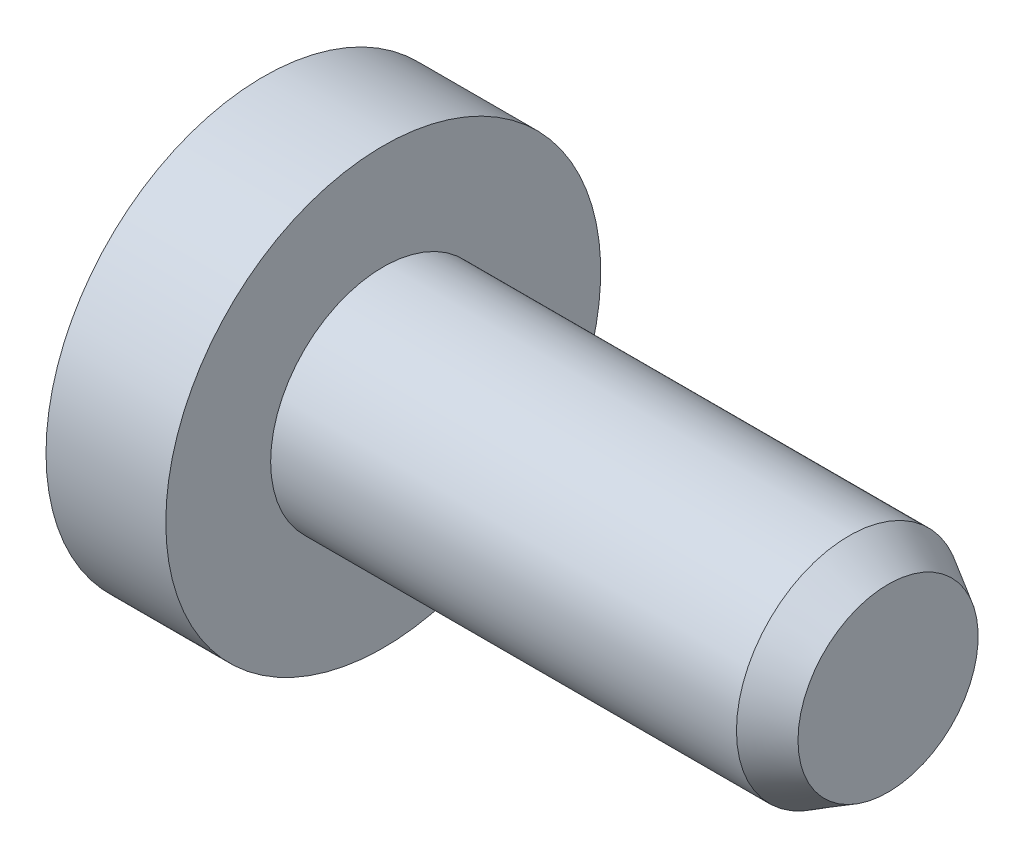
ISO-10303-21;
HEADER;
FILE_DESCRIPTION(('STEP AP214'),'2;1');
FILE_NAME('part.step','',(''),(''),'','','');
FILE_SCHEMA(('AUTOMOTIVE_DESIGN { 1 0 10303 214 1 1 1 1 }'));
ENDSEC;
DATA;
#1=APPLICATION_CONTEXT('core data for automotive mechanical design processes');
#2=APPLICATION_PROTOCOL_DEFINITION('international standard','automotive_design',2000,#1);
#3=PRODUCT_CONTEXT('',#1,'mechanical');
#4=PRODUCT('Part','Part','',(#3));
#5=PRODUCT_RELATED_PRODUCT_CATEGORY('part','',(#4));
#6=PRODUCT_DEFINITION_FORMATION('','',#4);
#7=PRODUCT_DEFINITION_CONTEXT('part definition',#1,'design');
#8=PRODUCT_DEFINITION('design','',#6,#7);
#9=PRODUCT_DEFINITION_SHAPE('','',#8);
#10=(LENGTH_UNIT() NAMED_UNIT(*) SI_UNIT(.MILLI.,.METRE.));
#11=(NAMED_UNIT(*) PLANE_ANGLE_UNIT() SI_UNIT($,.RADIAN.));
#12=(NAMED_UNIT(*) SI_UNIT($,.STERADIAN.) SOLID_ANGLE_UNIT());
#13=UNCERTAINTY_MEASURE_WITH_UNIT(LENGTH_MEASURE(1.E-05),#10,'distance_accuracy_value','');
#14=(GEOMETRIC_REPRESENTATION_CONTEXT(3) GLOBAL_UNCERTAINTY_ASSIGNED_CONTEXT((#13)) GLOBAL_UNIT_ASSIGNED_CONTEXT((#10,
#11,#12)) REPRESENTATION_CONTEXT('',''));
#15=CARTESIAN_POINT('',(0.,0.,0.));
#16=DIRECTION('',(0.,0.,1.));
#17=DIRECTION('',(1.,0.,0.));
#18=AXIS2_PLACEMENT_3D('',#15,#16,#17);
#19=CARTESIAN_POINT('',(2.6,0.,0.));
#20=DIRECTION('',(-1.,0.,0.));
#21=DIRECTION('',(0.,1.,0.));
#22=AXIS2_PLACEMENT_3D('',#19,#20,#21);
#23=SPHERICAL_SURFACE('',#22,5.);
#24=CARTESIAN_POINT('',(-1.5424630354416,0.,0.));
#25=DIRECTION('',(-1.,0.,0.));
#26=DIRECTION('',(0.,0.,1.));
#27=AXIS2_PLACEMENT_3D('',#24,#25,#26);
#28=CIRCLE('',#27,2.8);
#29=CARTESIAN_POINT('',(-1.5424630354416,0.,2.8));
#30=VERTEX_POINT('',#29);
#31=EDGE_CURVE('E190',#30,#30,#28,.T.);
#32=ORIENTED_EDGE('',*,*,#31,.T.);
#33=EDGE_LOOP('',(#32));
#34=FACE_BOUND('',#33,.T.);
#35=CARTESIAN_POINT('',(2.54536900183452,0.126064979712084,0.504259918848463));
#36=DIRECTION('',(0.104528463267654,-0.241206989505462,-0.964827958021852));
#37=DIRECTION('',(0.,0.970142500145332,-0.242535625036333));
#38=AXIS2_PLACEMENT_3D('',#35,#36,#37);
#39=CIRCLE('',#38,4.97260947684137);
#40=CARTESIAN_POINT('',(-2.16503660423949,1.47530435197317,-0.343370396666362));
#41=VERTEX_POINT('',#40);
#42=CARTESIAN_POINT('',(-2.31386531181066,0.898643984119679,-0.21532925298122));
#43=VERTEX_POINT('',#42);
#44=EDGE_CURVE('E11',#41,#43,#39,.F.);
#45=ORIENTED_EDGE('',*,*,#44,.F.);
#46=CARTESIAN_POINT('',(2.70130276994784,0.963831473505927,0.));
#47=DIRECTION('',(0.104528463267654,0.994521895368274,0.));
#48=DIRECTION('',(-0.994521895368275,0.104528463267653,0.));
#49=AXIS2_PLACEMENT_3D('',#46,#47,#48);
#50=CIRCLE('',#49,4.90517753394108);
#51=CARTESIAN_POINT('',(-2.16503660423949,1.47530435197316,0.343370396666362));
#52=VERTEX_POINT('',#51);
#53=EDGE_CURVE('E42',#52,#41,#50,.F.);
#54=ORIENTED_EDGE('',*,*,#53,.F.);
#55=CARTESIAN_POINT('',(2.54536900183452,0.126064979712112,-0.504259918848463));
#56=DIRECTION('',(0.104528463267654,-0.241206989505463,0.964827958021851));
#57=DIRECTION('',(0.,-0.970142500145332,-0.242535625036333));
#58=AXIS2_PLACEMENT_3D('',#55,#56,#57);
#59=CIRCLE('',#58,4.97260947684137);
#60=CARTESIAN_POINT('',(-2.31386531181066,0.898643984119693,0.21532925298122));
#61=VERTEX_POINT('',#60);
#62=EDGE_CURVE('E326',#61,#52,#59,.F.);
#63=ORIENTED_EDGE('',*,*,#62,.F.);
#64=CARTESIAN_POINT('',(2.61240552294261,0.0590153332605675,0.10221755563293));
#65=DIRECTION('',(0.104528463267654,0.49726094768413,0.861281226008778));
#66=DIRECTION('',(0.,-0.866025403784443,0.499999999999993));
#67=AXIS2_PLACEMENT_3D('',#64,#65,#66);
#68=CIRCLE('',#67,4.99859128802917);
#69=CARTESIAN_POINT('',(-2.35587459368451,0.468672066413427,0.468672066413406));
#70=VERTEX_POINT('',#69);
#71=EDGE_CURVE('E324',#70,#61,#68,.F.);
#72=ORIENTED_EDGE('',*,*,#71,.F.);
#73=CARTESIAN_POINT('',(2.61240552294261,0.102217555632889,0.0590153332605259));
#74=DIRECTION('',(0.104528463267654,0.861281226008778,0.497260947684129));
#75=DIRECTION('',(0.,-0.499999999999993,0.866025403784443));
#76=AXIS2_PLACEMENT_3D('',#73,#74,#75);
#77=CIRCLE('',#76,4.99859128802917);
#78=CARTESIAN_POINT('',(-2.31386531181066,0.215329252981206,0.898643984119665));
#79=VERTEX_POINT('',#78);
#80=EDGE_CURVE('E322',#79,#70,#77,.F.);
#81=ORIENTED_EDGE('',*,*,#80,.F.);
#82=CARTESIAN_POINT('',(2.54536900183452,-0.504259918848497,0.126064979712071));
#83=DIRECTION('',(0.104528463267654,0.964827958021851,-0.241206989505462));
#84=DIRECTION('',(0.,0.242535625036333,0.970142500145332));
#85=AXIS2_PLACEMENT_3D('',#82,#83,#84);
#86=CIRCLE('',#85,4.97260947684137);
#87=CARTESIAN_POINT('',(-2.16503660423949,0.34337039666632,1.47530435197316));
#88=VERTEX_POINT('',#87);
#89=EDGE_CURVE('E320',#88,#79,#86,.F.);
#90=ORIENTED_EDGE('',*,*,#89,.F.);
#91=CARTESIAN_POINT('',(2.70130276994784,0.,0.963831473505941));
#92=DIRECTION('',(0.104528463267654,0.,0.994521895368274));
#93=DIRECTION('',(0.994521895368275,0.,-0.104528463267654));
#94=AXIS2_PLACEMENT_3D('',#91,#92,#93);
#95=CIRCLE('',#94,4.90517753394107);
#96=CARTESIAN_POINT('',(-2.16503660423949,-0.343370396666376,1.47530435197317));
#97=VERTEX_POINT('',#96);
#98=EDGE_CURVE('E318',#97,#88,#95,.F.);
#99=ORIENTED_EDGE('',*,*,#98,.F.);
#100=CARTESIAN_POINT('',(2.54536900183452,0.504259918848456,0.126064979712112));
#101=DIRECTION('',(0.104528463267654,-0.964827958021851,-0.241206989505463));
#102=DIRECTION('',(0.,0.242535625036333,-0.970142500145332));
#103=AXIS2_PLACEMENT_3D('',#100,#101,#102);
#104=CIRCLE('',#103,4.97260947684137);
#105=CARTESIAN_POINT('',(-2.31386531181066,-0.21532925298122,0.898643984119707));
#106=VERTEX_POINT('',#105);
#107=EDGE_CURVE('E316',#106,#97,#104,.F.);
#108=ORIENTED_EDGE('',*,*,#107,.F.);
#109=CARTESIAN_POINT('',(2.61240552294261,-0.102217555632972,0.0590153332605675));
#110=DIRECTION('',(0.104528463267654,-0.861281226008778,0.49726094768413));
#111=DIRECTION('',(0.,-0.499999999999992,-0.866025403784443));
#112=AXIS2_PLACEMENT_3D('',#109,#110,#111);
#113=CIRCLE('',#112,4.99859128802917);
#114=CARTESIAN_POINT('',(-2.35587459368451,-0.468672066413454,0.468672066413447));
#115=VERTEX_POINT('',#114);
#116=EDGE_CURVE('E314',#115,#106,#113,.F.);
#117=ORIENTED_EDGE('',*,*,#116,.F.);
#118=CARTESIAN_POINT('',(2.61240552294261,-0.0590153332606091,0.10221755563293));
#119=DIRECTION('',(0.104528463267654,-0.497260947684129,0.861281226008779));
#120=DIRECTION('',(0.,-0.866025403784443,-0.499999999999992));
#121=AXIS2_PLACEMENT_3D('',#118,#119,#120);
#122=CIRCLE('',#121,4.99859128802917);
#123=CARTESIAN_POINT('',(-2.31386531181066,-0.898643984119749,0.21532925298122));
#124=VERTEX_POINT('',#123);
#125=EDGE_CURVE('E312',#124,#115,#122,.F.);
#126=ORIENTED_EDGE('',*,*,#125,.F.);
#127=CARTESIAN_POINT('',(2.54536900183452,-0.126064979712154,-0.504259918848504));
#128=DIRECTION('',(0.104528463267654,0.241206989505462,0.964827958021851));
#129=DIRECTION('',(0.,-0.970142500145332,0.242535625036333));
#130=AXIS2_PLACEMENT_3D('',#127,#128,#129);
#131=CIRCLE('',#130,4.97260947684137);
#132=CARTESIAN_POINT('',(-2.16503660423949,-1.47530435197318,0.343370396666293));
#133=VERTEX_POINT('',#132);
#134=EDGE_CURVE('E310',#133,#124,#131,.F.);
#135=ORIENTED_EDGE('',*,*,#134,.F.);
#136=CARTESIAN_POINT('',(2.70130276994784,-0.963831473505969,0.));
#137=DIRECTION('',(0.104528463267654,-0.994521895368273,0.));
#138=DIRECTION('',(0.994521895368275,0.104528463267654,0.));
#139=AXIS2_PLACEMENT_3D('',#136,#137,#138);
#140=CIRCLE('',#139,4.90517753394107);
#141=CARTESIAN_POINT('',(-2.16503660423949,-1.47530435197318,-0.343370396666362));
#142=VERTEX_POINT('',#141);
#143=EDGE_CURVE('E308',#142,#133,#140,.F.);
#144=ORIENTED_EDGE('',*,*,#143,.F.);
#145=CARTESIAN_POINT('',(2.54536900183452,-0.126064979712154,0.504259918848463));
#146=DIRECTION('',(0.104528463267654,0.241206989505463,-0.964827958021851));
#147=DIRECTION('',(0.,0.970142500145332,0.242535625036333));
#148=AXIS2_PLACEMENT_3D('',#145,#146,#147);
#149=CIRCLE('',#148,4.97260947684137);
#150=CARTESIAN_POINT('',(-2.31386531181066,-0.898643984119721,-0.215329252981275));
#151=VERTEX_POINT('',#150);
#152=EDGE_CURVE('E306',#151,#142,#149,.F.);
#153=ORIENTED_EDGE('',*,*,#152,.F.);
#154=CARTESIAN_POINT('',(2.61240552294261,-0.0590153332606022,-0.102217555632972));
#155=DIRECTION('',(0.104528463267654,-0.49726094768413,-0.861281226008778));
#156=DIRECTION('',(0.,0.866025403784443,-0.499999999999993));
#157=AXIS2_PLACEMENT_3D('',#154,#155,#156);
#158=CIRCLE('',#157,4.99859128802917);
#159=CARTESIAN_POINT('',(-2.35587459368451,-0.468672066413475,-0.468672066413434));
#160=VERTEX_POINT('',#159);
#161=EDGE_CURVE('E304',#160,#151,#158,.F.);
#162=ORIENTED_EDGE('',*,*,#161,.F.);
#163=CARTESIAN_POINT('',(2.61240552294261,-0.102217555632958,-0.0590153332606369));
#164=DIRECTION('',(0.104528463267654,-0.861281226008778,-0.497260947684129));
#165=DIRECTION('',(0.,0.499999999999993,-0.866025403784443));
#166=AXIS2_PLACEMENT_3D('',#163,#164,#165);
#167=CIRCLE('',#166,4.99859128802917);
#168=CARTESIAN_POINT('',(-2.31386531181066,-0.215329252981261,-0.898643984119693));
#169=VERTEX_POINT('',#168);
#170=EDGE_CURVE('E302',#169,#160,#167,.F.);
#171=ORIENTED_EDGE('',*,*,#170,.F.);
#172=CARTESIAN_POINT('',(2.54536900183452,0.504259918848428,-0.126064979712168));
#173=DIRECTION('',(0.104528463267654,-0.964827958021851,0.241206989505462));
#174=DIRECTION('',(0.,-0.242535625036333,-0.970142500145332));
#175=AXIS2_PLACEMENT_3D('',#172,#173,#174);
#176=CIRCLE('',#175,4.97260947684137);
#177=CARTESIAN_POINT('',(-2.16503660423949,-0.34337039666639,-1.47530435197317));
#178=VERTEX_POINT('',#177);
#179=EDGE_CURVE('E300',#178,#169,#176,.F.);
#180=ORIENTED_EDGE('',*,*,#179,.F.);
#181=CARTESIAN_POINT('',(2.70130276994784,0.,-0.963831473505969));
#182=DIRECTION('',(0.104528463267654,0.,-0.994521895368274));
#183=DIRECTION('',(-0.994521895368275,0.,-0.104528463267654));
#184=AXIS2_PLACEMENT_3D('',#181,#182,#183);
#185=CIRCLE('',#184,4.90517753394107);
#186=CARTESIAN_POINT('',(-2.16503660423949,0.343370396666348,-1.4753043519732));
#187=VERTEX_POINT('',#186);
#188=EDGE_CURVE('E298',#187,#178,#185,.F.);
#189=ORIENTED_EDGE('',*,*,#188,.F.);
#190=CARTESIAN_POINT('',(2.54536900183452,-0.504259918848476,-0.12606497971214));
#191=DIRECTION('',(0.104528463267654,0.964827958021851,0.241206989505463));
#192=DIRECTION('',(0.,-0.242535625036333,0.970142500145332));
#193=AXIS2_PLACEMENT_3D('',#190,#191,#192);
#194=CIRCLE('',#193,4.97260947684137);
#195=CARTESIAN_POINT('',(-2.31386531181066,0.215329252981192,-0.898643984119749));
#196=VERTEX_POINT('',#195);
#197=EDGE_CURVE('E296',#196,#187,#194,.F.);
#198=ORIENTED_EDGE('',*,*,#197,.F.);
#199=CARTESIAN_POINT('',(2.61240552294261,0.102217555632902,-0.0590153332606091));
#200=DIRECTION('',(0.104528463267654,0.861281226008779,-0.49726094768413));
#201=DIRECTION('',(0.,0.499999999999993,0.866025403784443));
#202=AXIS2_PLACEMENT_3D('',#199,#200,#201);
#203=CIRCLE('',#202,4.99859128802917);
#204=CARTESIAN_POINT('',(-2.35587459368451,0.468672066413427,-0.468672066413503));
#205=VERTEX_POINT('',#204);
#206=EDGE_CURVE('E294',#205,#196,#203,.F.);
#207=ORIENTED_EDGE('',*,*,#206,.F.);
#208=CARTESIAN_POINT('',(2.61240552294261,0.0590153332605536,-0.102217555632986));
#209=DIRECTION('',(0.104528463267654,0.497260947684129,-0.861281226008779));
#210=DIRECTION('',(0.,0.866025403784443,0.499999999999992));
#211=AXIS2_PLACEMENT_3D('',#208,#209,#210);
#212=CIRCLE('',#211,4.99859128802917);
#213=EDGE_CURVE('E292',#43,#205,#212,.F.);
#214=ORIENTED_EDGE('',*,*,#213,.F.);
#215=EDGE_LOOP('',(#45,#54,#63,#72,#81,#90,#99,#108,#117,#126,#135,#144,#153,#162,#171,#180,
#189,#198,#207,#214));
#216=FACE_BOUND('',#215,.T.);
#217=ADVANCED_FACE('F34',(#34,#216),#23,.T.);
#218=CARTESIAN_POINT('',(0.,1.44999999999998,0.));
#219=DIRECTION('',(-1.,0.,0.));
#220=DIRECTION('',(0.,0.,1.));
#221=AXIS2_PLACEMENT_3D('',#218,#219,#220);
#222=PLANE('',#221);
#223=CARTESIAN_POINT('',(0.,0.,0.));
#224=DIRECTION('',(-1.,0.,0.));
#225=DIRECTION('',(0.,0.,1.));
#226=AXIS2_PLACEMENT_3D('',#223,#224,#225);
#227=CIRCLE('',#226,2.8);
#228=CARTESIAN_POINT('',(0.,0.,2.8));
#229=VERTEX_POINT('',#228);
#230=EDGE_CURVE('E283',#229,#229,#227,.T.);
#231=ORIENTED_EDGE('',*,*,#230,.F.);
#232=EDGE_LOOP('',(#231));
#233=FACE_BOUND('',#232,.T.);
#234=CARTESIAN_POINT('',(0.,0.,0.));
#235=DIRECTION('',(-1.,0.,0.));
#236=DIRECTION('',(0.,0.,1.));
#237=AXIS2_PLACEMENT_3D('',#234,#235,#236);
#238=CIRCLE('',#237,1.45);
#239=CARTESIAN_POINT('',(0.,0.,1.45));
#240=VERTEX_POINT('',#239);
#241=EDGE_CURVE('E186',#240,#240,#238,.T.);
#242=ORIENTED_EDGE('',*,*,#241,.T.);
#243=EDGE_LOOP('',(#242));
#244=FACE_BOUND('',#243,.T.);
#245=ADVANCED_FACE('F422',(#233,#244),#222,.F.);
#246=CARTESIAN_POINT('',(0.,0.,0.));
#247=DIRECTION('',(-1.,0.,0.));
#248=DIRECTION('',(0.,0.,1.));
#249=AXIS2_PLACEMENT_3D('',#246,#247,#248);
#250=CYLINDRICAL_SURFACE('',#249,2.8);
#251=ORIENTED_EDGE('',*,*,#31,.F.);
#252=EDGE_LOOP('',(#251));
#253=FACE_BOUND('',#252,.T.);
#254=ORIENTED_EDGE('',*,*,#230,.T.);
#255=EDGE_LOOP('',(#254));
#256=FACE_BOUND('',#255,.T.);
#257=ADVANCED_FACE('F428',(#253,#256),#250,.T.);
#258=CARTESIAN_POINT('',(6.50000000000001,1.44999999999998,0.));
#259=DIRECTION('',(-1.,0.,0.));
#260=DIRECTION('',(0.,0.,1.));
#261=AXIS2_PLACEMENT_3D('',#258,#259,#260);
#262=PLANE('',#261);
#263=CARTESIAN_POINT('',(6.50000000000001,0.,0.));
#264=DIRECTION('',(-1.,0.,0.));
#265=DIRECTION('',(0.,0.,1.));
#266=AXIS2_PLACEMENT_3D('',#263,#264,#265);
#267=CIRCLE('',#266,1.16);
#268=CARTESIAN_POINT('',(6.50000000000001,0.,1.16));
#269=VERTEX_POINT('',#268);
#270=EDGE_CURVE('E289',#269,#269,#267,.F.);
#271=ORIENTED_EDGE('',*,*,#270,.T.);
#272=EDGE_LOOP('',(#271));
#273=FACE_BOUND('',#272,.T.);
#274=ADVANCED_FACE('F432',(#273),#262,.F.);
#275=CARTESIAN_POINT('',(0.,0.,0.));
#276=DIRECTION('',(-1.,0.,0.));
#277=DIRECTION('',(0.,0.,1.));
#278=AXIS2_PLACEMENT_3D('',#275,#276,#277);
#279=CYLINDRICAL_SURFACE('',#278,1.45);
#280=CARTESIAN_POINT('',(5.99770526580503,0.,0.));
#281=DIRECTION('',(-1.,0.,0.));
#282=DIRECTION('',(0.,0.,1.));
#283=AXIS2_PLACEMENT_3D('',#280,#281,#282);
#284=CIRCLE('',#283,1.45);
#285=CARTESIAN_POINT('',(5.99770526580503,0.,1.45));
#286=VERTEX_POINT('',#285);
#287=EDGE_CURVE('E286',#286,#286,#284,.T.);
#288=ORIENTED_EDGE('',*,*,#287,.T.);
#289=EDGE_LOOP('',(#288));
#290=FACE_BOUND('',#289,.T.);
#291=ORIENTED_EDGE('',*,*,#241,.F.);
#292=EDGE_LOOP('',(#291));
#293=FACE_BOUND('',#292,.T.);
#294=ADVANCED_FACE('F439',(#290,#293),#279,.T.);
#295=CARTESIAN_POINT('',(5.99770526580503,0.,0.));
#296=DIRECTION('',(-1.,0.,0.));
#297=DIRECTION('',(0.,0.,1.));
#298=AXIS2_PLACEMENT_3D('',#295,#296,#297);
#299=CONICAL_SURFACE('',#298,1.45,0.523598775598299);
#300=ORIENTED_EDGE('',*,*,#270,.F.);
#301=EDGE_LOOP('',(#300));
#302=FACE_BOUND('',#301,.T.);
#303=ORIENTED_EDGE('',*,*,#287,.F.);
#304=EDGE_LOOP('',(#303));
#305=FACE_BOUND('',#304,.T.);
#306=ADVANCED_FACE('F36',(#302,#305),#299,.T.);
#307=CARTESIAN_POINT('',(-2.40000000000001,1.49999999999998,-0.375000000000056));
#308=DIRECTION('',(0.104528463267654,-0.241206989505462,-0.964827958021852));
#309=DIRECTION('',(0.,0.970142500145332,-0.242535625036333));
#310=AXIS2_PLACEMENT_3D('',#307,#308,#309);
#311=PLANE('',#310);
#312=ORIENTED_EDGE('',*,*,#44,.T.);
#313=DIRECTION('',(-0.993634572314888,0.0156427600493605,-0.111560032084303));
#314=VECTOR('',#313,1.);
#315=CARTESIAN_POINT('',(-2.40000000000001,0.900000000000005,-0.224999999999975));
#316=LINE('',#315,#314);
#317=CARTESIAN_POINT('',(-1.,0.877959840891888,-0.0678154079279819));
#318=VERTEX_POINT('',#317);
#319=EDGE_CURVE('E49',#318,#43,#316,.T.);
#320=ORIENTED_EDGE('',*,*,#319,.F.);
#321=DIRECTION('',(0.,-0.970142500145332,0.242535625036333));
#322=VECTOR('',#321,1.);
#323=CARTESIAN_POINT('',(-1.,0.0356881299517636,0.142752519807124));
#324=LINE('',#323,#322);
#325=CARTESIAN_POINT('',(-1.,1.35285407062802,-0.186538965361971));
#326=VERTEX_POINT('',#325);
#327=EDGE_CURVE('E175',#318,#326,#324,.F.);
#328=ORIENTED_EDGE('',*,*,#327,.T.);
#329=DIRECTION('',(-0.98572742729342,0.103604127426078,-0.132693722013437));
#330=VECTOR('',#329,1.);
#331=CARTESIAN_POINT('',(-2.30190011908629,1.48968928703691,-0.361794282103672));
#332=LINE('',#331,#330);
#333=EDGE_CURVE('E182',#326,#41,#332,.T.);
#334=ORIENTED_EDGE('',*,*,#333,.T.);
#335=EDGE_LOOP('',(#312,#320,#328,#334));
#336=FACE_BOUND('',#335,.T.);
#337=ADVANCED_FACE('F181',(#336),#311,.F.);
#338=CARTESIAN_POINT('',(-2.40000000000001,1.49999999999997,0.375));
#339=DIRECTION('',(0.104528463267654,0.994521895368274,0.));
#340=DIRECTION('',(-0.994521895368275,0.104528463267653,0.));
#341=AXIS2_PLACEMENT_3D('',#338,#339,#340);
#342=PLANE('',#341);
#343=ORIENTED_EDGE('',*,*,#53,.T.);
#344=ORIENTED_EDGE('',*,*,#333,.F.);
#345=DIRECTION('',(0.,0.,-1.));
#346=VECTOR('',#345,1.);
#347=CARTESIAN_POINT('',(-1.,1.35285407062803,0.));
#348=LINE('',#347,#346);
#349=CARTESIAN_POINT('',(-1.,1.35285407062804,0.186538965361957));
#350=VERTEX_POINT('',#349);
#351=EDGE_CURVE('E171',#326,#350,#348,.F.);
#352=ORIENTED_EDGE('',*,*,#351,.T.);
#353=DIRECTION('',(-0.98572742729342,0.103604127426078,0.132693722013437));
#354=VECTOR('',#353,1.);
#355=CARTESIAN_POINT('',(-2.40000000000001,1.49999999999997,0.375));
#356=LINE('',#355,#354);
#357=EDGE_CURVE('E187',#350,#52,#356,.T.);
#358=ORIENTED_EDGE('',*,*,#357,.T.);
#359=EDGE_LOOP('',(#343,#344,#352,#358));
#360=FACE_BOUND('',#359,.T.);
#361=ADVANCED_FACE('F185',(#360),#342,.F.);
#362=CARTESIAN_POINT('',(-2.40000000000001,1.49999999999997,0.375));
#363=DIRECTION('',(0.104528463267654,-0.241206989505463,0.964827958021851));
#364=DIRECTION('',(0.,-0.970142500145332,-0.242535625036333));
#365=AXIS2_PLACEMENT_3D('',#362,#363,#364);
#366=PLANE('',#365);
#367=ORIENTED_EDGE('',*,*,#62,.T.);
#368=ORIENTED_EDGE('',*,*,#357,.F.);
#369=DIRECTION('',(0.,0.970142500145332,0.242535625036333));
#370=VECTOR('',#369,1.);
#371=CARTESIAN_POINT('',(-1.,0.0356881299517636,-0.142752519807166));
#372=LINE('',#371,#370);
#373=CARTESIAN_POINT('',(-1.,0.877959840891888,0.0678154079279125));
#374=VERTEX_POINT('',#373);
#375=EDGE_CURVE('E177',#350,#374,#372,.F.);
#376=ORIENTED_EDGE('',*,*,#375,.T.);
#377=DIRECTION('',(-0.993634572314888,0.0156427600493605,0.111560032084303));
#378=VECTOR('',#377,1.);
#379=CARTESIAN_POINT('',(-2.42595339803002,0.900408583587094,0.227913910201605));
#380=LINE('',#379,#378);
#381=EDGE_CURVE('E192',#374,#61,#380,.T.);
#382=ORIENTED_EDGE('',*,*,#381,.T.);
#383=EDGE_LOOP('',(#367,#368,#376,#382));
#384=FACE_BOUND('',#383,.T.);
#385=ADVANCED_FACE('F329',(#384),#366,.F.);
#386=CARTESIAN_POINT('',(-2.40000000000001,0.89999999999997,0.225000000000003));
#387=DIRECTION('',(0.104528463267654,0.49726094768413,0.861281226008778));
#388=DIRECTION('',(0.,-0.866025403784443,0.499999999999993));
#389=AXIS2_PLACEMENT_3D('',#386,#387,#388);
#390=PLANE('',#389);
#391=ORIENTED_EDGE('',*,*,#71,.T.);
#392=ORIENTED_EDGE('',*,*,#381,.F.);
#393=DIRECTION('',(0.,0.866025403784443,-0.499999999999993));
#394=VECTOR('',#393,1.);
#395=CARTESIAN_POINT('',(-1.,0.24885489323976,0.431029318803428));
#396=LINE('',#395,#394);
#397=CARTESIAN_POINT('',(-1.,0.364348851127266,0.36434885112728));
#398=VERTEX_POINT('',#397);
#399=EDGE_CURVE('E248',#374,#398,#396,.F.);
#400=ORIENTED_EDGE('',*,*,#399,.T.);
#401=DIRECTION('',(-0.99413204049762,0.0764901498757905,0.0764901498757905));
#402=VECTOR('',#401,1.);
#403=CARTESIAN_POINT('',(-2.41375326491225,0.473125346316369,0.473125346316397));
#404=LINE('',#403,#402);
#405=EDGE_CURVE('E242',#398,#70,#404,.T.);
#406=ORIENTED_EDGE('',*,*,#405,.T.);
#407=EDGE_LOOP('',(#391,#392,#400,#406));
#408=FACE_BOUND('',#407,.T.);
#409=ADVANCED_FACE('F412',(#408),#390,.F.);
#410=CARTESIAN_POINT('',(-2.40000000000001,0.224999999999975,0.900000000000012));
#411=DIRECTION('',(0.104528463267654,0.861281226008778,0.497260947684129));
#412=DIRECTION('',(0.,-0.499999999999993,0.866025403784443));
#413=AXIS2_PLACEMENT_3D('',#410,#411,#412);
#414=PLANE('',#413);
#415=ORIENTED_EDGE('',*,*,#80,.T.);
#416=ORIENTED_EDGE('',*,*,#405,.F.);
#417=DIRECTION('',(0.,0.499999999999993,-0.866025403784443));
#418=VECTOR('',#417,1.);
#419=CARTESIAN_POINT('',(-1.,0.431029318803407,0.248854893239753));
#420=LINE('',#419,#418);
#421=CARTESIAN_POINT('',(-1.,0.0678154079279125,0.877959840891951));
#422=VERTEX_POINT('',#421);
#423=EDGE_CURVE('E250',#398,#422,#420,.F.);
#424=ORIENTED_EDGE('',*,*,#423,.T.);
#425=DIRECTION('',(-0.993634572314888,0.111560032084303,0.0156427600493604));
#426=VECTOR('',#425,1.);
#427=CARTESIAN_POINT('',(-2.40000000000001,0.224999999999975,0.900000000000012));
#428=LINE('',#427,#426);
#429=EDGE_CURVE('E239',#422,#79,#428,.T.);
#430=ORIENTED_EDGE('',*,*,#429,.T.);
#431=EDGE_LOOP('',(#415,#416,#424,#430));
#432=FACE_BOUND('',#431,.T.);
#433=ADVANCED_FACE('F409',(#432),#414,.F.);
#434=CARTESIAN_POINT('',(-2.40000000000001,0.374999999999973,1.49999999999996));
#435=DIRECTION('',(0.104528463267654,0.964827958021851,-0.241206989505462));
#436=DIRECTION('',(0.,0.242535625036333,0.970142500145332));
#437=AXIS2_PLACEMENT_3D('',#434,#435,#436);
#438=PLANE('',#437);
#439=ORIENTED_EDGE('',*,*,#89,.T.);
#440=ORIENTED_EDGE('',*,*,#429,.F.);
#441=DIRECTION('',(0.,-0.242535625036333,-0.970142500145332));
#442=VECTOR('',#441,1.);
#443=CARTESIAN_POINT('',(-1.,-0.142752519807124,0.0356881299517775));
#444=LINE('',#443,#442);
#445=CARTESIAN_POINT('',(-1.,0.18653896536195,1.35285407062805));
#446=VERTEX_POINT('',#445);
#447=EDGE_CURVE('E252',#422,#446,#444,.F.);
#448=ORIENTED_EDGE('',*,*,#447,.T.);
#449=DIRECTION('',(-0.98572742729342,0.132693722013437,0.103604127426078));
#450=VECTOR('',#449,1.);
#451=CARTESIAN_POINT('',(-2.30190011908629,0.361794282103645,1.48968928703694));
#452=LINE('',#451,#450);
#453=EDGE_CURVE('E236',#446,#88,#452,.T.);
#454=ORIENTED_EDGE('',*,*,#453,.T.);
#455=EDGE_LOOP('',(#439,#440,#448,#454));
#456=FACE_BOUND('',#455,.T.);
#457=ADVANCED_FACE('F406',(#456),#438,.F.);
#458=CARTESIAN_POINT('',(-2.40000000000001,-0.375000000000014,1.49999999999999));
#459=DIRECTION('',(0.104528463267654,0.,0.994521895368274));
#460=DIRECTION('',(0.994521895368275,0.,-0.104528463267654));
#461=AXIS2_PLACEMENT_3D('',#458,#459,#460);
#462=PLANE('',#461);
#463=ORIENTED_EDGE('',*,*,#98,.T.);
#464=ORIENTED_EDGE('',*,*,#453,.F.);
#465=DIRECTION('',(0.,1.,0.));
#466=VECTOR('',#465,1.);
#467=CARTESIAN_POINT('',(-1.,0.,1.35285407062803));
#468=LINE('',#467,#466);
#469=CARTESIAN_POINT('',(-1.,-0.186538965361999,1.35285407062806));
#470=VERTEX_POINT('',#469);
#471=EDGE_CURVE('E254',#446,#470,#468,.F.);
#472=ORIENTED_EDGE('',*,*,#471,.T.);
#473=DIRECTION('',(-0.98572742729342,-0.132693722013437,0.103604127426078));
#474=VECTOR('',#473,1.);
#475=CARTESIAN_POINT('',(-2.40000000000001,-0.375000000000014,1.49999999999999));
#476=LINE('',#475,#474);
#477=EDGE_CURVE('E233',#470,#97,#476,.T.);
#478=ORIENTED_EDGE('',*,*,#477,.T.);
#479=EDGE_LOOP('',(#463,#464,#472,#478));
#480=FACE_BOUND('',#479,.T.);
#481=ADVANCED_FACE('F399',(#480),#462,.F.);
#482=CARTESIAN_POINT('',(-2.40000000000001,-0.375000000000014,1.49999999999999));
#483=DIRECTION('',(0.104528463267654,-0.964827958021851,-0.241206989505463));
#484=DIRECTION('',(0.,0.242535625036333,-0.970142500145332));
#485=AXIS2_PLACEMENT_3D('',#482,#483,#484);
#486=PLANE('',#485);
#487=ORIENTED_EDGE('',*,*,#107,.T.);
#488=ORIENTED_EDGE('',*,*,#477,.F.);
#489=DIRECTION('',(0.,-0.242535625036333,0.970142500145332));
#490=VECTOR('',#489,1.);
#491=CARTESIAN_POINT('',(-1.,0.142752519807096,0.0356881299517775));
#492=LINE('',#491,#490);
#493=CARTESIAN_POINT('',(-1.,-0.067815407927975,0.877959840891923));
#494=VERTEX_POINT('',#493);
#495=EDGE_CURVE('E256',#470,#494,#492,.F.);
#496=ORIENTED_EDGE('',*,*,#495,.T.);
#497=DIRECTION('',(-0.993634572314888,-0.111560032084303,0.0156427600493604));
#498=VECTOR('',#497,1.);
#499=CARTESIAN_POINT('',(-2.42595339803002,-0.227913910201619,0.900408583587128));
#500=LINE('',#499,#498);
#501=EDGE_CURVE('E230',#494,#106,#500,.T.);
#502=ORIENTED_EDGE('',*,*,#501,.T.);
#503=EDGE_LOOP('',(#487,#488,#496,#502));
#504=FACE_BOUND('',#503,.T.);
#505=ADVANCED_FACE('F397',(#504),#486,.F.);
#506=CARTESIAN_POINT('',(-2.40000000000001,-0.225000000000017,0.899999999999998));
#507=DIRECTION('',(0.104528463267654,-0.861281226008778,0.49726094768413));
#508=DIRECTION('',(0.,-0.499999999999992,-0.866025403784443));
#509=AXIS2_PLACEMENT_3D('',#506,#507,#508);
#510=PLANE('',#509);
#511=ORIENTED_EDGE('',*,*,#116,.T.);
#512=ORIENTED_EDGE('',*,*,#501,.F.);
#513=DIRECTION('',(0.,0.499999999999992,0.866025403784443));
#514=VECTOR('',#513,1.);
#515=CARTESIAN_POINT('',(-1.,-0.431029318803469,0.248854893239753));
#516=LINE('',#515,#514);
#517=CARTESIAN_POINT('',(-1.,-0.364348851127308,0.36434885112728));
#518=VERTEX_POINT('',#517);
#519=EDGE_CURVE('E258',#494,#518,#516,.F.);
#520=ORIENTED_EDGE('',*,*,#519,.T.);
#521=DIRECTION('',(-0.99413204049762,-0.0764901498757908,0.0764901498757904));
#522=VECTOR('',#521,1.);
#523=CARTESIAN_POINT('',(-2.41375326491225,-0.473125346316411,0.473125346316383));
#524=LINE('',#523,#522);
#525=EDGE_CURVE('E227',#518,#115,#524,.T.);
#526=ORIENTED_EDGE('',*,*,#525,.T.);
#527=EDGE_LOOP('',(#511,#512,#520,#526));
#528=FACE_BOUND('',#527,.T.);
#529=ADVANCED_FACE('F390',(#528),#510,.F.);
#530=CARTESIAN_POINT('',(-2.40000000000001,-0.900000000000033,0.224999999999934));
#531=DIRECTION('',(0.104528463267654,-0.497260947684129,0.861281226008779));
#532=DIRECTION('',(0.,-0.866025403784443,-0.499999999999992));
#533=AXIS2_PLACEMENT_3D('',#530,#531,#532);
#534=PLANE('',#533);
#535=ORIENTED_EDGE('',*,*,#125,.T.);
#536=ORIENTED_EDGE('',*,*,#525,.F.);
#537=DIRECTION('',(0.,0.866025403784443,0.499999999999992));
#538=VECTOR('',#537,1.);
#539=CARTESIAN_POINT('',(-1.,-0.248854893239808,0.431029318803414));
#540=LINE('',#539,#538);
#541=CARTESIAN_POINT('',(-1.,-0.877959840891951,0.0678154079278709));
#542=VERTEX_POINT('',#541);
#543=EDGE_CURVE('E260',#518,#542,#540,.F.);
#544=ORIENTED_EDGE('',*,*,#543,.T.);
#545=DIRECTION('',(-0.993634572314888,-0.0156427600493607,0.111560032084303));
#546=VECTOR('',#545,1.);
#547=CARTESIAN_POINT('',(-2.40000000000001,-0.900000000000033,0.224999999999934));
#548=LINE('',#547,#546);
#549=EDGE_CURVE('E224',#542,#124,#548,.T.);
#550=ORIENTED_EDGE('',*,*,#549,.T.);
#551=EDGE_LOOP('',(#535,#536,#544,#550));
#552=FACE_BOUND('',#551,.T.);
#553=ADVANCED_FACE('F387',(#552),#534,.F.);
#554=CARTESIAN_POINT('',(-2.40000000000001,-1.50000000000003,0.374999999999986));
#555=DIRECTION('',(0.104528463267654,0.241206989505462,0.964827958021851));
#556=DIRECTION('',(0.,-0.970142500145332,0.242535625036333));
#557=AXIS2_PLACEMENT_3D('',#554,#555,#556);
#558=PLANE('',#557);
#559=ORIENTED_EDGE('',*,*,#134,.T.);
#560=ORIENTED_EDGE('',*,*,#549,.F.);
#561=DIRECTION('',(0.,0.970142500145332,-0.242535625036333));
#562=VECTOR('',#561,1.);
#563=CARTESIAN_POINT('',(-1.,-0.0356881299518122,-0.142752519807124));
#564=LINE('',#563,#562);
#565=CARTESIAN_POINT('',(-1.,-1.35285407062809,0.186538965361902));
#566=VERTEX_POINT('',#565);
#567=EDGE_CURVE('E262',#542,#566,#564,.F.);
#568=ORIENTED_EDGE('',*,*,#567,.T.);
#569=DIRECTION('',(-0.98572742729342,-0.103604127426078,0.132693722013437));
#570=VECTOR('',#569,1.);
#571=CARTESIAN_POINT('',(-2.30190011908629,-1.48968928703692,0.361794282103672));
#572=LINE('',#571,#570);
#573=EDGE_CURVE('E221',#566,#133,#572,.T.);
#574=ORIENTED_EDGE('',*,*,#573,.T.);
#575=EDGE_LOOP('',(#559,#560,#568,#574));
#576=FACE_BOUND('',#575,.T.);
#577=ADVANCED_FACE('F379',(#576),#558,.F.);
#578=CARTESIAN_POINT('',(-2.40000000000001,-1.50000000000003,-0.375000000000028));
#579=DIRECTION('',(0.104528463267654,-0.994521895368273,0.));
#580=DIRECTION('',(0.994521895368275,0.104528463267654,0.));
#581=AXIS2_PLACEMENT_3D('',#578,#579,#580);
#582=PLANE('',#581);
#583=ORIENTED_EDGE('',*,*,#143,.T.);
#584=ORIENTED_EDGE('',*,*,#573,.F.);
#585=DIRECTION('',(0.,0.,1.));
#586=VECTOR('',#585,1.);
#587=CARTESIAN_POINT('',(-1.,-1.35285407062807,0.));
#588=LINE('',#587,#586);
#589=CARTESIAN_POINT('',(-1.,-1.35285407062807,-0.186538965362013));
#590=VERTEX_POINT('',#589);
#591=EDGE_CURVE('E264',#566,#590,#588,.F.);
#592=ORIENTED_EDGE('',*,*,#591,.T.);
#593=DIRECTION('',(-0.98572742729342,-0.103604127426078,-0.132693722013437));
#594=VECTOR('',#593,1.);
#595=CARTESIAN_POINT('',(-2.40000000000001,-1.50000000000003,-0.375000000000028));
#596=LINE('',#595,#594);
#597=EDGE_CURVE('E218',#590,#142,#596,.T.);
#598=ORIENTED_EDGE('',*,*,#597,.T.);
#599=EDGE_LOOP('',(#583,#584,#592,#598));
#600=FACE_BOUND('',#599,.T.);
#601=ADVANCED_FACE('F377',(#600),#582,.F.);
#602=CARTESIAN_POINT('',(-2.40000000000001,-1.50000000000003,-0.375000000000028));
#603=DIRECTION('',(0.104528463267654,0.241206989505463,-0.964827958021851));
#604=DIRECTION('',(0.,0.970142500145332,0.242535625036333));
#605=AXIS2_PLACEMENT_3D('',#602,#603,#604);
#606=PLANE('',#605);
#607=ORIENTED_EDGE('',*,*,#152,.T.);
#608=ORIENTED_EDGE('',*,*,#597,.F.);
#609=DIRECTION('',(0.,-0.970142500145332,-0.242535625036333));
#610=VECTOR('',#609,1.);
#611=CARTESIAN_POINT('',(-1.,-0.0356881299517983,0.14275251980711));
#612=LINE('',#611,#610);
#613=CARTESIAN_POINT('',(-1.,-0.877959840891951,-0.0678154079279403));
#614=VERTEX_POINT('',#613);
#615=EDGE_CURVE('E266',#590,#614,#612,.F.);
#616=ORIENTED_EDGE('',*,*,#615,.T.);
#617=DIRECTION('',(-0.993634572314888,-0.0156427600493608,-0.111560032084303));
#618=VECTOR('',#617,1.);
#619=CARTESIAN_POINT('',(-2.42595339803002,-0.900408583587156,-0.227913910201605));
#620=LINE('',#619,#618);
#621=EDGE_CURVE('E215',#614,#151,#620,.T.);
#622=ORIENTED_EDGE('',*,*,#621,.T.);
#623=EDGE_LOOP('',(#607,#608,#616,#622));
#624=FACE_BOUND('',#623,.T.);
#625=ADVANCED_FACE('F370',(#624),#606,.F.);
#626=CARTESIAN_POINT('',(-2.40000000000001,-0.900000000000033,-0.225000000000031));
#627=DIRECTION('',(0.104528463267654,-0.49726094768413,-0.861281226008778));
#628=DIRECTION('',(0.,0.866025403784443,-0.499999999999993));
#629=AXIS2_PLACEMENT_3D('',#626,#627,#628);
#630=PLANE('',#629);
#631=ORIENTED_EDGE('',*,*,#161,.T.);
#632=ORIENTED_EDGE('',*,*,#621,.F.);
#633=DIRECTION('',(0.,-0.866025403784443,0.499999999999993));
#634=VECTOR('',#633,1.);
#635=CARTESIAN_POINT('',(-1.,-0.248854893239808,-0.431029318803455));
#636=LINE('',#635,#634);
#637=CARTESIAN_POINT('',(-1.,-0.364348851127329,-0.364348851127308));
#638=VERTEX_POINT('',#637);
#639=EDGE_CURVE('E268',#614,#638,#636,.F.);
#640=ORIENTED_EDGE('',*,*,#639,.T.);
#641=DIRECTION('',(-0.99413204049762,-0.0764901498757908,-0.0764901498757908));
#642=VECTOR('',#641,1.);
#643=CARTESIAN_POINT('',(-2.41375326491225,-0.473125346316411,-0.473125346316397));
#644=LINE('',#643,#642);
#645=EDGE_CURVE('E212',#638,#160,#644,.T.);
#646=ORIENTED_EDGE('',*,*,#645,.T.);
#647=EDGE_LOOP('',(#631,#632,#640,#646));
#648=FACE_BOUND('',#647,.T.);
#649=ADVANCED_FACE('F367',(#648),#630,.F.);
#650=CARTESIAN_POINT('',(-2.40000000000001,-0.22500000000001,-0.900000000000012));
#651=DIRECTION('',(0.104528463267654,-0.861281226008778,-0.497260947684129));
#652=DIRECTION('',(0.,0.499999999999993,-0.866025403784443));
#653=AXIS2_PLACEMENT_3D('',#650,#651,#652);
#654=PLANE('',#653);
#655=ORIENTED_EDGE('',*,*,#170,.T.);
#656=ORIENTED_EDGE('',*,*,#645,.F.);
#657=DIRECTION('',(0.,-0.499999999999993,0.866025403784443));
#658=VECTOR('',#657,1.);
#659=CARTESIAN_POINT('',(-1.,-0.431029318803434,-0.24885489323978));
#660=LINE('',#659,#658);
#661=CARTESIAN_POINT('',(-1.,-0.0678154079279542,-0.877959840891979));
#662=VERTEX_POINT('',#661);
#663=EDGE_CURVE('E270',#638,#662,#660,.F.);
#664=ORIENTED_EDGE('',*,*,#663,.T.);
#665=DIRECTION('',(-0.993634572314888,-0.111560032084303,-0.0156427600493608));
#666=VECTOR('',#665,1.);
#667=CARTESIAN_POINT('',(-2.40000000000001,-0.22500000000001,-0.900000000000012));
#668=LINE('',#667,#666);
#669=EDGE_CURVE('E209',#662,#169,#668,.T.);
#670=ORIENTED_EDGE('',*,*,#669,.T.);
#671=EDGE_LOOP('',(#655,#656,#664,#670));
#672=FACE_BOUND('',#671,.T.);
#673=ADVANCED_FACE('F359',(#672),#654,.F.);
#674=CARTESIAN_POINT('',(-2.40000000000001,-0.375000000000035,-1.50000000000007));
#675=DIRECTION('',(0.104528463267654,-0.964827958021851,0.241206989505462));
#676=DIRECTION('',(0.,-0.242535625036333,-0.970142500145332));
#677=AXIS2_PLACEMENT_3D('',#674,#675,#676);
#678=PLANE('',#677);
#679=ORIENTED_EDGE('',*,*,#179,.T.);
#680=ORIENTED_EDGE('',*,*,#669,.F.);
#681=DIRECTION('',(0.,0.242535625036333,0.970142500145332));
#682=VECTOR('',#681,1.);
#683=CARTESIAN_POINT('',(-1.,0.142752519807103,-0.0356881299517914));
#684=LINE('',#683,#682);
#685=CARTESIAN_POINT('',(-1.,-0.186538965361985,-1.35285407062806));
#686=VERTEX_POINT('',#685);
#687=EDGE_CURVE('E272',#662,#686,#684,.F.);
#688=ORIENTED_EDGE('',*,*,#687,.T.);
#689=DIRECTION('',(-0.98572742729342,-0.132693722013437,-0.103604127426078));
#690=VECTOR('',#689,1.);
#691=CARTESIAN_POINT('',(-2.30190011908629,-0.361794282103686,-1.48968928703692));
#692=LINE('',#691,#690);
#693=EDGE_CURVE('E206',#686,#178,#692,.T.);
#694=ORIENTED_EDGE('',*,*,#693,.T.);
#695=EDGE_LOOP('',(#679,#680,#688,#694));
#696=FACE_BOUND('',#695,.T.);
#697=ADVANCED_FACE('F357',(#696),#678,.F.);
#698=CARTESIAN_POINT('',(-2.40000000000001,0.374999999999959,-1.50000000000003));
#699=DIRECTION('',(0.104528463267654,0.,-0.994521895368274));
#700=DIRECTION('',(-0.994521895368275,0.,-0.104528463267654));
#701=AXIS2_PLACEMENT_3D('',#698,#699,#700);
#702=PLANE('',#701);
#703=ORIENTED_EDGE('',*,*,#188,.T.);
#704=ORIENTED_EDGE('',*,*,#693,.F.);
#705=DIRECTION('',(0.,-1.,0.));
#706=VECTOR('',#705,1.);
#707=CARTESIAN_POINT('',(-1.,0.,-1.35285407062809));
#708=LINE('',#707,#706);
#709=CARTESIAN_POINT('',(-1.,0.186538965361957,-1.35285407062806));
#710=VERTEX_POINT('',#709);
#711=EDGE_CURVE('E274',#686,#710,#708,.F.);
#712=ORIENTED_EDGE('',*,*,#711,.T.);
#713=DIRECTION('',(-0.98572742729342,0.132693722013437,-0.103604127426078));
#714=VECTOR('',#713,1.);
#715=CARTESIAN_POINT('',(-2.40000000000001,0.374999999999959,-1.50000000000003));
#716=LINE('',#715,#714);
#717=EDGE_CURVE('E203',#710,#187,#716,.T.);
#718=ORIENTED_EDGE('',*,*,#717,.T.);
#719=EDGE_LOOP('',(#703,#704,#712,#718));
#720=FACE_BOUND('',#719,.T.);
#721=ADVANCED_FACE('F350',(#720),#702,.F.);
#722=CARTESIAN_POINT('',(-2.40000000000001,0.374999999999959,-1.50000000000003));
#723=DIRECTION('',(0.104528463267654,0.964827958021851,0.241206989505463));
#724=DIRECTION('',(0.,-0.242535625036333,0.970142500145332));
#725=AXIS2_PLACEMENT_3D('',#722,#723,#724);
#726=PLANE('',#725);
#727=ORIENTED_EDGE('',*,*,#197,.T.);
#728=ORIENTED_EDGE('',*,*,#717,.F.);
#729=DIRECTION('',(0.,0.242535625036333,-0.970142500145332));
#730=VECTOR('',#729,1.);
#731=CARTESIAN_POINT('',(-1.,-0.142752519807117,-0.0356881299517775));
#732=LINE('',#731,#730);
#733=CARTESIAN_POINT('',(-1.,0.0678154079279125,-0.877959840891937));
#734=VERTEX_POINT('',#733);
#735=EDGE_CURVE('E276',#710,#734,#732,.F.);
#736=ORIENTED_EDGE('',*,*,#735,.T.);
#737=DIRECTION('',(-0.993634572314888,0.111560032084303,-0.0156427600493608));
#738=VECTOR('',#737,1.);
#739=CARTESIAN_POINT('',(-2.42595339803002,0.227913910201591,-0.900408583587184));
#740=LINE('',#739,#738);
#741=EDGE_CURVE('E200',#734,#196,#740,.T.);
#742=ORIENTED_EDGE('',*,*,#741,.T.);
#743=EDGE_LOOP('',(#727,#728,#736,#742));
#744=FACE_BOUND('',#743,.T.);
#745=ADVANCED_FACE('F347',(#744),#726,.F.);
#746=CARTESIAN_POINT('',(-2.40000000000001,0.224999999999968,-0.900000000000026));
#747=DIRECTION('',(0.104528463267654,0.861281226008779,-0.49726094768413));
#748=DIRECTION('',(0.,0.499999999999993,0.866025403784443));
#749=AXIS2_PLACEMENT_3D('',#746,#747,#748);
#750=PLANE('',#749);
#751=ORIENTED_EDGE('',*,*,#206,.T.);
#752=ORIENTED_EDGE('',*,*,#741,.F.);
#753=DIRECTION('',(0.,-0.499999999999993,-0.866025403784443));
#754=VECTOR('',#753,1.);
#755=CARTESIAN_POINT('',(-1.,0.431029318803414,-0.248854893239767));
#756=LINE('',#755,#754);
#757=CARTESIAN_POINT('',(-1.,0.36434885112728,-0.364348851127308));
#758=VERTEX_POINT('',#757);
#759=EDGE_CURVE('E278',#734,#758,#756,.F.);
#760=ORIENTED_EDGE('',*,*,#759,.T.);
#761=DIRECTION('',(-0.99413204049762,0.0764901498757905,-0.0764901498757908));
#762=VECTOR('',#761,1.);
#763=CARTESIAN_POINT('',(-2.41375326491225,0.473125346316376,-0.473125346316397));
#764=LINE('',#763,#762);
#765=EDGE_CURVE('E196',#758,#205,#764,.T.);
#766=ORIENTED_EDGE('',*,*,#765,.T.);
#767=EDGE_LOOP('',(#751,#752,#760,#766));
#768=FACE_BOUND('',#767,.T.);
#769=ADVANCED_FACE('F339',(#768),#750,.F.);
#770=CARTESIAN_POINT('',(-2.40000000000001,0.900000000000005,-0.224999999999975));
#771=DIRECTION('',(0.104528463267654,0.497260947684129,-0.861281226008779));
#772=DIRECTION('',(0.,0.866025403784443,0.499999999999992));
#773=AXIS2_PLACEMENT_3D('',#770,#771,#772);
#774=PLANE('',#773);
#775=ORIENTED_EDGE('',*,*,#213,.T.);
#776=ORIENTED_EDGE('',*,*,#765,.F.);
#777=DIRECTION('',(0.,-0.866025403784443,-0.499999999999992));
#778=VECTOR('',#777,1.);
#779=CARTESIAN_POINT('',(-1.,0.248854893239739,-0.431029318803469));
#780=LINE('',#779,#778);
#781=EDGE_CURVE('E197',#758,#318,#780,.F.);
#782=ORIENTED_EDGE('',*,*,#781,.T.);
#783=ORIENTED_EDGE('',*,*,#319,.T.);
#784=EDGE_LOOP('',(#775,#776,#782,#783));
#785=FACE_BOUND('',#784,.T.);
#786=ADVANCED_FACE('F337',(#785),#774,.F.);
#787=CARTESIAN_POINT('',(-1.,0.,0.));
#788=DIRECTION('',(-1.,0.,0.));
#789=DIRECTION('',(0.,0.,1.));
#790=AXIS2_PLACEMENT_3D('',#787,#788,#789);
#791=PLANE('',#790);
#792=ORIENTED_EDGE('',*,*,#327,.F.);
#793=ORIENTED_EDGE('',*,*,#781,.F.);
#794=ORIENTED_EDGE('',*,*,#759,.F.);
#795=ORIENTED_EDGE('',*,*,#735,.F.);
#796=ORIENTED_EDGE('',*,*,#711,.F.);
#797=ORIENTED_EDGE('',*,*,#687,.F.);
#798=ORIENTED_EDGE('',*,*,#663,.F.);
#799=ORIENTED_EDGE('',*,*,#639,.F.);
#800=ORIENTED_EDGE('',*,*,#615,.F.);
#801=ORIENTED_EDGE('',*,*,#591,.F.);
#802=ORIENTED_EDGE('',*,*,#567,.F.);
#803=ORIENTED_EDGE('',*,*,#543,.F.);
#804=ORIENTED_EDGE('',*,*,#519,.F.);
#805=ORIENTED_EDGE('',*,*,#495,.F.);
#806=ORIENTED_EDGE('',*,*,#471,.F.);
#807=ORIENTED_EDGE('',*,*,#447,.F.);
#808=ORIENTED_EDGE('',*,*,#423,.F.);
#809=ORIENTED_EDGE('',*,*,#399,.F.);
#810=ORIENTED_EDGE('',*,*,#375,.F.);
#811=ORIENTED_EDGE('',*,*,#351,.F.);
#812=EDGE_LOOP('',(#792,#793,#794,#795,#796,#797,#798,#799,#800,#801,#802,#803,#804,#805,#806,
#807,#808,#809,#810,#811));
#813=FACE_BOUND('',#812,.T.);
#814=ADVANCED_FACE('F173',(#813),#791,.T.);
#815=CLOSED_SHELL('',(#217,#245,#257,#274,#294,#306,#337,#361,#385,#409,#433,#457,#481,#505,
#529,#553,#577,#601,#625,#649,#673,#697,#721,#745,#769,#786,#814));
#816=MANIFOLD_SOLID_BREP('B2',#815);
#817=ADVANCED_BREP_SHAPE_REPRESENTATION('',(#18,#816),#14);
#818=SHAPE_DEFINITION_REPRESENTATION(#9,#817);
ENDSEC;
END-ISO-10303-21;
